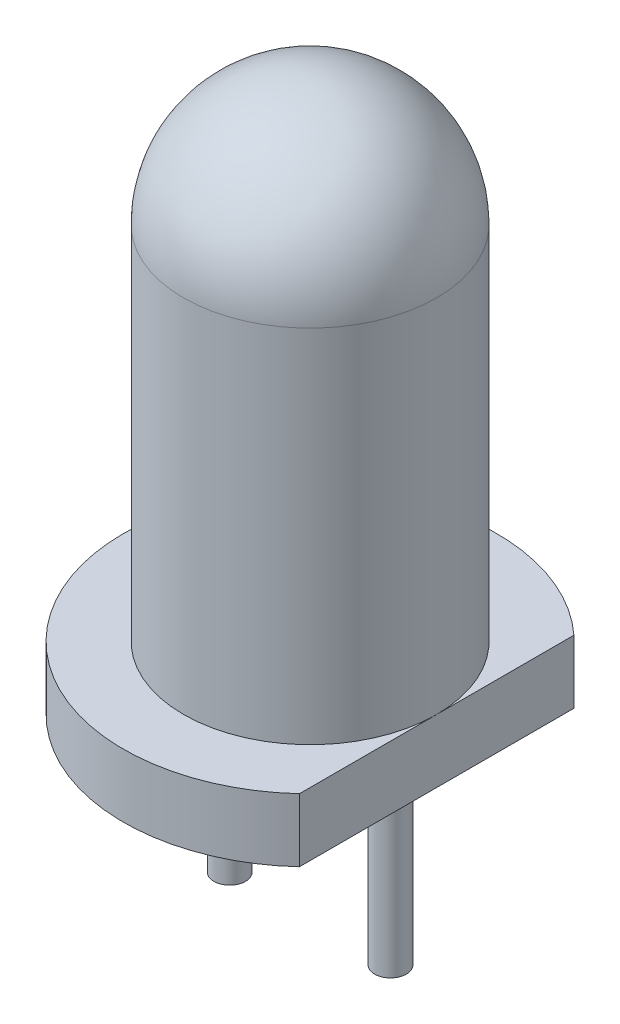
ISO-10303-21;
HEADER;
FILE_DESCRIPTION(('STEP AP214'),'2;1');
FILE_NAME('part.step','',(''),(''),'','','');
FILE_SCHEMA(('AUTOMOTIVE_DESIGN { 1 0 10303 214 1 1 1 1 }'));
ENDSEC;
DATA;
#1=APPLICATION_CONTEXT('core data for automotive mechanical design processes');
#2=APPLICATION_PROTOCOL_DEFINITION('international standard','automotive_design',2000,#1);
#3=PRODUCT_CONTEXT('',#1,'mechanical');
#4=PRODUCT('Part','Part','',(#3));
#5=PRODUCT_RELATED_PRODUCT_CATEGORY('part','',(#4));
#6=PRODUCT_DEFINITION_FORMATION('','',#4);
#7=PRODUCT_DEFINITION_CONTEXT('part definition',#1,'design');
#8=PRODUCT_DEFINITION('design','',#6,#7);
#9=PRODUCT_DEFINITION_SHAPE('','',#8);
#10=(LENGTH_UNIT() NAMED_UNIT(*) SI_UNIT(.MILLI.,.METRE.));
#11=(NAMED_UNIT(*) PLANE_ANGLE_UNIT() SI_UNIT($,.RADIAN.));
#12=(NAMED_UNIT(*) SI_UNIT($,.STERADIAN.) SOLID_ANGLE_UNIT());
#13=UNCERTAINTY_MEASURE_WITH_UNIT(LENGTH_MEASURE(1.E-05),#10,'distance_accuracy_value','');
#14=(GEOMETRIC_REPRESENTATION_CONTEXT(3) GLOBAL_UNCERTAINTY_ASSIGNED_CONTEXT((#13)) GLOBAL_UNIT_ASSIGNED_CONTEXT((#10,
#11,#12)) REPRESENTATION_CONTEXT('',''));
#15=CARTESIAN_POINT('',(0.,0.,0.));
#16=DIRECTION('',(0.,0.,1.));
#17=DIRECTION('',(1.,0.,0.));
#18=AXIS2_PLACEMENT_3D('',#15,#16,#17);
#19=CARTESIAN_POINT('',(0.,3.85,0.));
#20=DIRECTION('',(0.,-1.,0.));
#21=DIRECTION('',(0.,0.,-1.));
#22=AXIS2_PLACEMENT_3D('',#19,#20,#21);
#23=CYLINDRICAL_SURFACE('',#22,2.);
#24=CARTESIAN_POINT('',(0.,1.,0.));
#25=DIRECTION('',(0.,-1.,0.));
#26=DIRECTION('',(0.,0.,-1.));
#27=AXIS2_PLACEMENT_3D('',#24,#25,#26);
#28=CIRCLE('',#27,2.);
#29=CARTESIAN_POINT('',(2.,1.,0.));
#30=VERTEX_POINT('',#29);
#31=EDGE_CURVE('E21',#30,#30,#28,.T.);
#32=ORIENTED_EDGE('',*,*,#31,.F.);
#33=EDGE_LOOP('',(#32));
#34=FACE_BOUND('',#33,.T.);
#35=CARTESIAN_POINT('',(0.,6.7,0.));
#36=DIRECTION('',(0.,-1.,0.));
#37=DIRECTION('',(0.,0.,-1.));
#38=AXIS2_PLACEMENT_3D('',#35,#36,#37);
#39=CIRCLE('',#38,2.);
#40=CARTESIAN_POINT('',(2.,6.7,0.));
#41=VERTEX_POINT('',#40);
#42=CARTESIAN_POINT('',(-2.,6.7,0.));
#43=VERTEX_POINT('',#42);
#44=EDGE_CURVE('E83',#41,#43,#39,.T.);
#45=ORIENTED_EDGE('',*,*,#44,.T.);
#46=CARTESIAN_POINT('',(0.,6.7,0.));
#47=DIRECTION('',(0.,-1.,0.));
#48=DIRECTION('',(0.,0.,-1.));
#49=AXIS2_PLACEMENT_3D('',#46,#47,#48);
#50=CIRCLE('',#49,2.);
#51=EDGE_CURVE('E80',#43,#41,#50,.T.);
#52=ORIENTED_EDGE('',*,*,#51,.T.);
#53=EDGE_LOOP('',(#45,#52));
#54=FACE_BOUND('',#53,.T.);
#55=ADVANCED_FACE('F16',(#34,#54),#23,.T.);
#56=CARTESIAN_POINT('',(0.,6.7,0.));
#57=DIRECTION('',(1.,0.,0.));
#58=DIRECTION('',(0.,1.,0.));
#59=AXIS2_PLACEMENT_3D('',#56,#57,#58);
#60=SPHERICAL_SURFACE('',#59,2.);
#61=ORIENTED_EDGE('',*,*,#51,.F.);
#62=ORIENTED_EDGE('',*,*,#44,.F.);
#63=EDGE_LOOP('',(#61,#62));
#64=FACE_BOUND('',#63,.T.);
#65=ADVANCED_FACE('F18',(#64),#60,.T.);
#66=CARTESIAN_POINT('',(2.,1.,-2.16852484422));
#67=DIRECTION('',(-1.,0.,0.));
#68=DIRECTION('',(0.,0.,1.));
#69=AXIS2_PLACEMENT_3D('',#66,#67,#68);
#70=PLANE('',#69);
#71=DIRECTION('',(0.,1.,0.));
#72=VECTOR('',#71,1.);
#73=CARTESIAN_POINT('',(2.,1.,-2.16852484422));
#74=LINE('',#73,#72);
#75=CARTESIAN_POINT('',(2.,1.,-2.16852484422007));
#76=VERTEX_POINT('',#75);
#77=CARTESIAN_POINT('',(2.,0.,-2.16852484422007));
#78=VERTEX_POINT('',#77);
#79=EDGE_CURVE('E58',#76,#78,#74,.F.);
#80=ORIENTED_EDGE('',*,*,#79,.F.);
#81=CARTESIAN_POINT('',(2.,1.,-2.16852484422007));
#82=CARTESIAN_POINT('',(2.,1.,2.16852484422007));
#83=B_SPLINE_CURVE_WITH_KNOTS('',1,(#81,#82),.UNSPECIFIED.,.F.,.F.,(2,2),(0.,1.),.UNSPECIFIED.);
#84=EDGE_CURVE('E27',#76,#30,#83,.T.);
#85=ORIENTED_EDGE('',*,*,#84,.T.);
#86=CARTESIAN_POINT('',(2.,1.,2.16852484422004));
#87=VERTEX_POINT('',#86);
#88=EDGE_CURVE('E35',#30,#87,#83,.T.);
#89=ORIENTED_EDGE('',*,*,#88,.T.);
#90=DIRECTION('',(0.,1.,0.));
#91=VECTOR('',#90,1.);
#92=CARTESIAN_POINT('',(2.,1.,2.16852484422));
#93=LINE('',#92,#91);
#94=CARTESIAN_POINT('',(2.,0.,2.16852484422007));
#95=VERTEX_POINT('',#94);
#96=EDGE_CURVE('E49',#95,#87,#93,.T.);
#97=ORIENTED_EDGE('',*,*,#96,.F.);
#98=DIRECTION('',(0.,0.,1.));
#99=VECTOR('',#98,1.);
#100=CARTESIAN_POINT('',(2.,0.,-2.16852484422));
#101=LINE('',#100,#99);
#102=EDGE_CURVE('E53',#78,#95,#101,.T.);
#103=ORIENTED_EDGE('',*,*,#102,.F.);
#104=EDGE_LOOP('',(#80,#85,#89,#97,#103));
#105=FACE_BOUND('',#104,.T.);
#106=ADVANCED_FACE('F52',(#105),#70,.F.);
#107=CARTESIAN_POINT('',(0.,0.5,0.));
#108=DIRECTION('',(0.,-1.,0.));
#109=DIRECTION('',(0.,0.,-1.));
#110=AXIS2_PLACEMENT_3D('',#107,#108,#109);
#111=CYLINDRICAL_SURFACE('',#110,2.95);
#112=ORIENTED_EDGE('',*,*,#96,.T.);
#113=CARTESIAN_POINT('',(0.,1.,0.));
#114=DIRECTION('',(0.,-1.,0.));
#115=DIRECTION('',(0.,0.,-1.));
#116=AXIS2_PLACEMENT_3D('',#113,#114,#115);
#117=CIRCLE('',#116,2.95);
#118=EDGE_CURVE('E11',#87,#76,#117,.T.);
#119=ORIENTED_EDGE('',*,*,#118,.T.);
#120=ORIENTED_EDGE('',*,*,#79,.T.);
#121=CARTESIAN_POINT('',(0.,0.,0.));
#122=DIRECTION('',(0.,-1.,0.));
#123=DIRECTION('',(0.,0.,-1.));
#124=AXIS2_PLACEMENT_3D('',#121,#122,#123);
#125=CIRCLE('',#124,2.95);
#126=EDGE_CURVE('E62',#78,#95,#125,.F.);
#127=ORIENTED_EDGE('',*,*,#126,.T.);
#128=EDGE_LOOP('',(#112,#119,#120,#127));
#129=FACE_BOUND('',#128,.T.);
#130=ADVANCED_FACE('F64',(#129),#111,.T.);
#131=CARTESIAN_POINT('',(1.475,0.,0.));
#132=DIRECTION('',(0.,-1.,0.));
#133=DIRECTION('',(0.,0.,-1.));
#134=AXIS2_PLACEMENT_3D('',#131,#132,#133);
#135=PLANE('',#134);
#136=CARTESIAN_POINT('',(-1.27,0.,0.));
#137=DIRECTION('',(0.,-1.,0.));
#138=DIRECTION('',(0.,0.,-1.));
#139=AXIS2_PLACEMENT_3D('',#136,#137,#138);
#140=CIRCLE('',#139,0.25);
#141=CARTESIAN_POINT('',(-1.27,0.,-0.25));
#142=VERTEX_POINT('',#141);
#143=EDGE_CURVE('E65',#142,#142,#140,.F.);
#144=ORIENTED_EDGE('',*,*,#143,.T.);
#145=EDGE_LOOP('',(#144));
#146=FACE_BOUND('',#145,.T.);
#147=CARTESIAN_POINT('',(1.27,0.,0.));
#148=DIRECTION('',(0.,-1.,0.));
#149=DIRECTION('',(0.,0.,-1.));
#150=AXIS2_PLACEMENT_3D('',#147,#148,#149);
#151=CIRCLE('',#150,0.25);
#152=CARTESIAN_POINT('',(1.27,0.,-0.25));
#153=VERTEX_POINT('',#152);
#154=EDGE_CURVE('E68',#153,#153,#151,.F.);
#155=ORIENTED_EDGE('',*,*,#154,.T.);
#156=EDGE_LOOP('',(#155));
#157=FACE_BOUND('',#156,.T.);
#158=ORIENTED_EDGE('',*,*,#102,.T.);
#159=ORIENTED_EDGE('',*,*,#126,.F.);
#160=EDGE_LOOP('',(#158,#159));
#161=FACE_BOUND('',#160,.T.);
#162=ADVANCED_FACE('F61',(#146,#157,#161),#135,.T.);
#163=CARTESIAN_POINT('',(-1.27,0.,0.));
#164=DIRECTION('',(0.,-1.,0.));
#165=DIRECTION('',(0.,0.,-1.));
#166=AXIS2_PLACEMENT_3D('',#163,#164,#165);
#167=CYLINDRICAL_SURFACE('',#166,0.25);
#168=CARTESIAN_POINT('',(-1.27,-2.794,0.));
#169=DIRECTION('',(0.,-1.,0.));
#170=DIRECTION('',(0.,0.,-1.));
#171=AXIS2_PLACEMENT_3D('',#168,#169,#170);
#172=CIRCLE('',#171,0.25);
#173=CARTESIAN_POINT('',(-1.27,-2.794,-0.25));
#174=VERTEX_POINT('',#173);
#175=EDGE_CURVE('E74',#174,#174,#172,.F.);
#176=ORIENTED_EDGE('',*,*,#175,.T.);
#177=EDGE_LOOP('',(#176));
#178=FACE_BOUND('',#177,.T.);
#179=ORIENTED_EDGE('',*,*,#143,.F.);
#180=EDGE_LOOP('',(#179));
#181=FACE_BOUND('',#180,.T.);
#182=ADVANCED_FACE('F113',(#178,#181),#167,.T.);
#183=CARTESIAN_POINT('',(1.27,0.,0.));
#184=DIRECTION('',(0.,-1.,0.));
#185=DIRECTION('',(0.,0.,-1.));
#186=AXIS2_PLACEMENT_3D('',#183,#184,#185);
#187=CYLINDRICAL_SURFACE('',#186,0.25);
#188=CARTESIAN_POINT('',(1.27,-2.794,0.));
#189=DIRECTION('',(0.,-1.,0.));
#190=DIRECTION('',(0.,0.,-1.));
#191=AXIS2_PLACEMENT_3D('',#188,#189,#190);
#192=CIRCLE('',#191,0.25);
#193=CARTESIAN_POINT('',(1.27,-2.794,-0.25));
#194=VERTEX_POINT('',#193);
#195=EDGE_CURVE('E77',#194,#194,#192,.F.);
#196=ORIENTED_EDGE('',*,*,#195,.T.);
#197=EDGE_LOOP('',(#196));
#198=FACE_BOUND('',#197,.T.);
#199=ORIENTED_EDGE('',*,*,#154,.F.);
#200=EDGE_LOOP('',(#199));
#201=FACE_BOUND('',#200,.T.);
#202=ADVANCED_FACE('F117',(#198,#201),#187,.T.);
#203=CARTESIAN_POINT('',(1.27,-2.794,0.));
#204=DIRECTION('',(0.,1.,0.));
#205=DIRECTION('',(0.,0.,1.));
#206=AXIS2_PLACEMENT_3D('',#203,#204,#205);
#207=PLANE('',#206);
#208=ORIENTED_EDGE('',*,*,#195,.F.);
#209=EDGE_LOOP('',(#208));
#210=FACE_BOUND('',#209,.T.);
#211=ADVANCED_FACE('F105',(#210),#207,.F.);
#212=CARTESIAN_POINT('',(-1.27,-2.794,0.));
#213=DIRECTION('',(0.,1.,0.));
#214=DIRECTION('',(0.,0.,1.));
#215=AXIS2_PLACEMENT_3D('',#212,#213,#214);
#216=PLANE('',#215);
#217=ORIENTED_EDGE('',*,*,#175,.F.);
#218=EDGE_LOOP('',(#217));
#219=FACE_BOUND('',#218,.T.);
#220=ADVANCED_FACE('F99',(#219),#216,.F.);
#221=CARTESIAN_POINT('',(2.475,1.,0.));
#222=DIRECTION('',(0.,1.,0.));
#223=DIRECTION('',(0.,0.,1.));
#224=AXIS2_PLACEMENT_3D('',#221,#222,#223);
#225=PLANE('',#224);
#226=ORIENTED_EDGE('',*,*,#88,.F.);
#227=ORIENTED_EDGE('',*,*,#31,.T.);
#228=ORIENTED_EDGE('',*,*,#84,.F.);
#229=ORIENTED_EDGE('',*,*,#118,.F.);
#230=EDGE_LOOP('',(#226,#227,#228,#229));
#231=FACE_BOUND('',#230,.T.);
#232=ADVANCED_FACE('F97',(#231),#225,.T.);
#233=CLOSED_SHELL('',(#55,#65,#106,#130,#162,#182,#202,#211,#220,#232));
#234=MANIFOLD_SOLID_BREP('B1',#233);
#235=ADVANCED_BREP_SHAPE_REPRESENTATION('',(#18,#234),#14);
#236=SHAPE_DEFINITION_REPRESENTATION(#9,#235);
ENDSEC;
END-ISO-10303-21;
